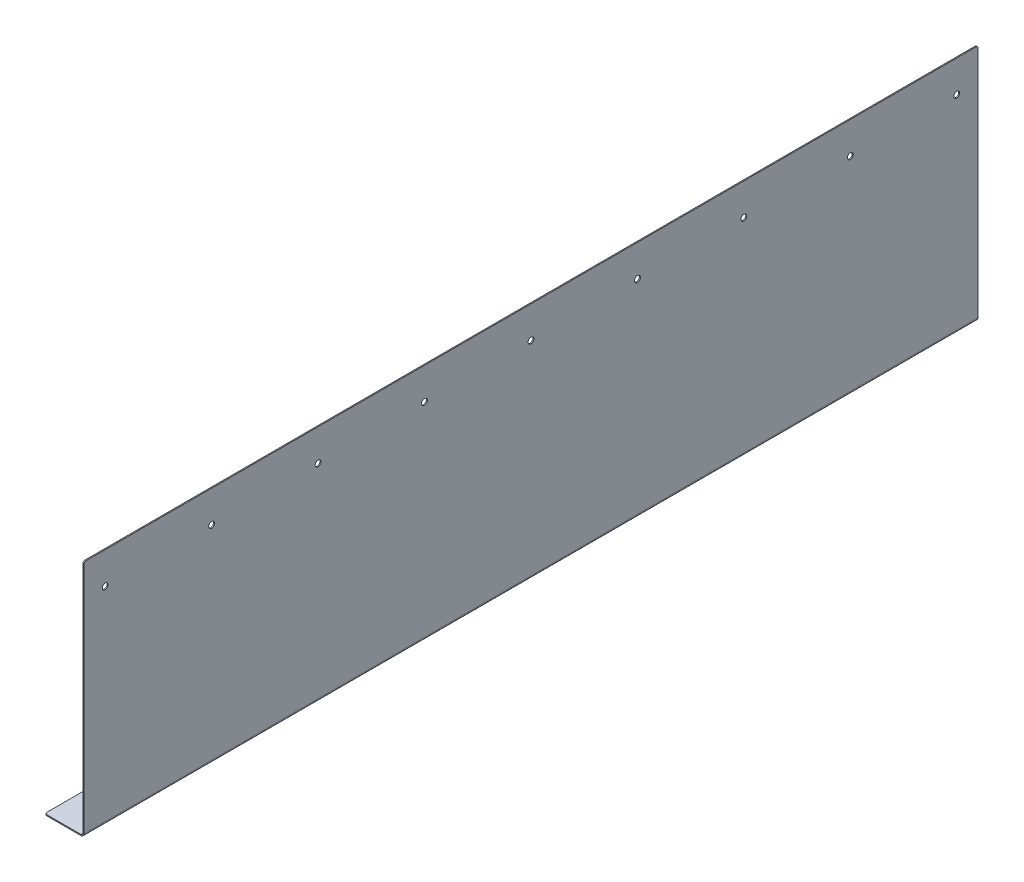
ISO-10303-21;
HEADER;
FILE_DESCRIPTION(('STEP AP214'),'2;1');
FILE_NAME('part.step','',(''),(''),'','','');
FILE_SCHEMA(('AUTOMOTIVE_DESIGN { 1 0 10303 214 1 1 1 1 }'));
ENDSEC;
DATA;
#1=APPLICATION_CONTEXT('core data for automotive mechanical design processes');
#2=APPLICATION_PROTOCOL_DEFINITION('international standard','automotive_design',2000,#1);
#3=PRODUCT_CONTEXT('',#1,'mechanical');
#4=PRODUCT('Part','Part','',(#3));
#5=PRODUCT_RELATED_PRODUCT_CATEGORY('part','',(#4));
#6=PRODUCT_DEFINITION_FORMATION('','',#4);
#7=PRODUCT_DEFINITION_CONTEXT('part definition',#1,'design');
#8=PRODUCT_DEFINITION('design','',#6,#7);
#9=PRODUCT_DEFINITION_SHAPE('','',#8);
#10=(LENGTH_UNIT() NAMED_UNIT(*) SI_UNIT(.MILLI.,.METRE.));
#11=(NAMED_UNIT(*) PLANE_ANGLE_UNIT() SI_UNIT($,.RADIAN.));
#12=(NAMED_UNIT(*) SI_UNIT($,.STERADIAN.) SOLID_ANGLE_UNIT());
#13=UNCERTAINTY_MEASURE_WITH_UNIT(LENGTH_MEASURE(1.E-05),#10,'distance_accuracy_value','');
#14=(GEOMETRIC_REPRESENTATION_CONTEXT(3) GLOBAL_UNCERTAINTY_ASSIGNED_CONTEXT((#13)) GLOBAL_UNIT_ASSIGNED_CONTEXT((#10,
#11,#12)) REPRESENTATION_CONTEXT('',''));
#15=CARTESIAN_POINT('',(0.,0.,0.));
#16=DIRECTION('',(0.,0.,1.));
#17=DIRECTION('',(1.,0.,0.));
#18=AXIS2_PLACEMENT_3D('',#15,#16,#17);
#19=CARTESIAN_POINT('',(1.,0.,421.5));
#20=DIRECTION('',(-1.,0.,0.));
#21=DIRECTION('',(0.,0.,1.));
#22=AXIS2_PLACEMENT_3D('',#19,#20,#21);
#23=PLANE('',#22);
#24=CARTESIAN_POINT('',(1.,195.,-301.125));
#25=DIRECTION('',(-1.,0.,0.));
#26=DIRECTION('',(0.,0.,1.));
#27=AXIS2_PLACEMENT_3D('',#24,#25,#26);
#28=CIRCLE('',#27,2.75);
#29=CARTESIAN_POINT('',(1.,195.,-298.375));
#30=VERTEX_POINT('',#29);
#31=EDGE_CURVE('E378',#30,#30,#28,.T.);
#32=ORIENTED_EDGE('',*,*,#31,.T.);
#33=EDGE_LOOP('',(#32));
#34=FACE_BOUND('',#33,.T.);
#35=CARTESIAN_POINT('',(1.,195.,-200.75));
#36=DIRECTION('',(-1.,0.,0.));
#37=DIRECTION('',(0.,0.,1.));
#38=AXIS2_PLACEMENT_3D('',#35,#36,#37);
#39=CIRCLE('',#38,2.75);
#40=CARTESIAN_POINT('',(1.,195.,-198.));
#41=VERTEX_POINT('',#40);
#42=EDGE_CURVE('E371',#41,#41,#39,.T.);
#43=ORIENTED_EDGE('',*,*,#42,.T.);
#44=EDGE_LOOP('',(#43));
#45=FACE_BOUND('',#44,.T.);
#46=CARTESIAN_POINT('',(1.,195.,-100.375));
#47=DIRECTION('',(-1.,0.,0.));
#48=DIRECTION('',(0.,0.,1.));
#49=AXIS2_PLACEMENT_3D('',#46,#47,#48);
#50=CIRCLE('',#49,2.75);
#51=CARTESIAN_POINT('',(1.,195.,-97.625));
#52=VERTEX_POINT('',#51);
#53=EDGE_CURVE('E362',#52,#52,#50,.T.);
#54=ORIENTED_EDGE('',*,*,#53,.T.);
#55=EDGE_LOOP('',(#54));
#56=FACE_BOUND('',#55,.T.);
#57=CARTESIAN_POINT('',(1.,195.,0.));
#58=DIRECTION('',(-1.,0.,0.));
#59=DIRECTION('',(0.,0.,1.));
#60=AXIS2_PLACEMENT_3D('',#57,#58,#59);
#61=CIRCLE('',#60,2.75);
#62=CARTESIAN_POINT('',(1.,195.,2.75));
#63=VERTEX_POINT('',#62);
#64=EDGE_CURVE('E353',#63,#63,#61,.T.);
#65=ORIENTED_EDGE('',*,*,#64,.T.);
#66=EDGE_LOOP('',(#65));
#67=FACE_BOUND('',#66,.T.);
#68=CARTESIAN_POINT('',(1.,195.,100.375));
#69=DIRECTION('',(-1.,0.,0.));
#70=DIRECTION('',(0.,0.,1.));
#71=AXIS2_PLACEMENT_3D('',#68,#69,#70);
#72=CIRCLE('',#71,2.75);
#73=CARTESIAN_POINT('',(1.,195.,103.125));
#74=VERTEX_POINT('',#73);
#75=EDGE_CURVE('E344',#74,#74,#72,.T.);
#76=ORIENTED_EDGE('',*,*,#75,.T.);
#77=EDGE_LOOP('',(#76));
#78=FACE_BOUND('',#77,.T.);
#79=CARTESIAN_POINT('',(1.,195.,200.75));
#80=DIRECTION('',(-1.,0.,0.));
#81=DIRECTION('',(0.,0.,1.));
#82=AXIS2_PLACEMENT_3D('',#79,#80,#81);
#83=CIRCLE('',#82,2.75);
#84=CARTESIAN_POINT('',(1.,195.,203.5));
#85=VERTEX_POINT('',#84);
#86=EDGE_CURVE('E335',#85,#85,#83,.T.);
#87=ORIENTED_EDGE('',*,*,#86,.T.);
#88=EDGE_LOOP('',(#87));
#89=FACE_BOUND('',#88,.T.);
#90=CARTESIAN_POINT('',(1.,195.,301.125));
#91=DIRECTION('',(-1.,0.,0.));
#92=DIRECTION('',(0.,0.,1.));
#93=AXIS2_PLACEMENT_3D('',#90,#91,#92);
#94=CIRCLE('',#93,2.75);
#95=CARTESIAN_POINT('',(1.,195.,303.875));
#96=VERTEX_POINT('',#95);
#97=EDGE_CURVE('E326',#96,#96,#94,.T.);
#98=ORIENTED_EDGE('',*,*,#97,.T.);
#99=EDGE_LOOP('',(#98));
#100=FACE_BOUND('',#99,.T.);
#101=CARTESIAN_POINT('',(1.,195.,401.5));
#102=DIRECTION('',(-1.,0.,0.));
#103=DIRECTION('',(0.,0.,1.));
#104=AXIS2_PLACEMENT_3D('',#101,#102,#103);
#105=CIRCLE('',#104,2.75);
#106=CARTESIAN_POINT('',(1.,195.,404.25));
#107=VERTEX_POINT('',#106);
#108=EDGE_CURVE('E316',#107,#107,#105,.T.);
#109=ORIENTED_EDGE('',*,*,#108,.T.);
#110=EDGE_LOOP('',(#109));
#111=FACE_BOUND('',#110,.T.);
#112=CARTESIAN_POINT('',(1.,195.,-401.5));
#113=DIRECTION('',(-1.,0.,0.));
#114=DIRECTION('',(0.,0.,1.));
#115=AXIS2_PLACEMENT_3D('',#112,#113,#114);
#116=CIRCLE('',#115,2.75);
#117=CARTESIAN_POINT('',(1.,195.,-398.75));
#118=VERTEX_POINT('',#117);
#119=EDGE_CURVE('E211',#118,#118,#116,.T.);
#120=ORIENTED_EDGE('',*,*,#119,.T.);
#121=EDGE_LOOP('',(#120));
#122=FACE_BOUND('',#121,.T.);
#123=DIRECTION('',(0.,0.,-1.));
#124=VECTOR('',#123,1.);
#125=CARTESIAN_POINT('',(1.,225.,421.5));
#126=LINE('',#125,#124);
#127=CARTESIAN_POINT('',(1.,225.,419.5));
#128=VERTEX_POINT('',#127);
#129=CARTESIAN_POINT('',(1.,225.,-419.5));
#130=VERTEX_POINT('',#129);
#131=EDGE_CURVE('E238',#128,#130,#126,.T.);
#132=ORIENTED_EDGE('',*,*,#131,.F.);
#133=CARTESIAN_POINT('',(1.,223.,419.5));
#134=DIRECTION('',(-1.,0.,0.));
#135=DIRECTION('',(0.,0.,1.));
#136=AXIS2_PLACEMENT_3D('',#133,#134,#135);
#137=CIRCLE('',#136,2.);
#138=CARTESIAN_POINT('',(1.,223.,421.5));
#139=VERTEX_POINT('',#138);
#140=EDGE_CURVE('E265',#128,#139,#137,.F.);
#141=ORIENTED_EDGE('',*,*,#140,.T.);
#142=DIRECTION('',(0.,1.,0.));
#143=VECTOR('',#142,1.);
#144=CARTESIAN_POINT('',(1.,0.,421.5));
#145=LINE('',#144,#143);
#146=CARTESIAN_POINT('',(1.,2.99999999999999,421.5));
#147=VERTEX_POINT('',#146);
#148=EDGE_CURVE('E228',#147,#139,#145,.T.);
#149=ORIENTED_EDGE('',*,*,#148,.F.);
#150=DIRECTION('',(0.,0.,1.));
#151=VECTOR('',#150,1.);
#152=CARTESIAN_POINT('',(1.,2.99999999999999,421.5));
#153=LINE('',#152,#151);
#154=CARTESIAN_POINT('',(1.,2.99999999999999,-421.5));
#155=VERTEX_POINT('',#154);
#156=EDGE_CURVE('E166',#147,#155,#153,.F.);
#157=ORIENTED_EDGE('',*,*,#156,.T.);
#158=DIRECTION('',(0.,1.,0.));
#159=VECTOR('',#158,1.);
#160=CARTESIAN_POINT('',(1.,0.,-421.5));
#161=LINE('',#160,#159);
#162=CARTESIAN_POINT('',(1.,223.,-421.5));
#163=VERTEX_POINT('',#162);
#164=EDGE_CURVE('E225',#155,#163,#161,.T.);
#165=ORIENTED_EDGE('',*,*,#164,.T.);
#166=CARTESIAN_POINT('',(1.,223.,-419.5));
#167=DIRECTION('',(-1.,0.,0.));
#168=DIRECTION('',(0.,0.,1.));
#169=AXIS2_PLACEMENT_3D('',#166,#167,#168);
#170=CIRCLE('',#169,2.);
#171=EDGE_CURVE('E263',#163,#130,#170,.F.);
#172=ORIENTED_EDGE('',*,*,#171,.T.);
#173=EDGE_LOOP('',(#132,#141,#149,#157,#165,#172));
#174=FACE_BOUND('',#173,.T.);
#175=ADVANCED_FACE('F64',(#34,#45,#56,#67,#78,#89,#100,#111,#122,#174),#23,.F.);
#176=CARTESIAN_POINT('',(0.,0.,421.5));
#177=DIRECTION('',(-1.,0.,0.));
#178=DIRECTION('',(0.,0.,1.));
#179=AXIS2_PLACEMENT_3D('',#176,#177,#178);
#180=PLANE('',#179);
#181=CARTESIAN_POINT('',(0.,195.,-301.125));
#182=DIRECTION('',(-1.,0.,0.));
#183=DIRECTION('',(0.,0.,1.));
#184=AXIS2_PLACEMENT_3D('',#181,#182,#183);
#185=CIRCLE('',#184,2.775);
#186=CARTESIAN_POINT('',(0.,195.,-298.35));
#187=VERTEX_POINT('',#186);
#188=EDGE_CURVE('E370',#187,#187,#185,.T.);
#189=ORIENTED_EDGE('',*,*,#188,.F.);
#190=EDGE_LOOP('',(#189));
#191=FACE_BOUND('',#190,.T.);
#192=CARTESIAN_POINT('',(0.,195.,-200.75));
#193=DIRECTION('',(-1.,0.,0.));
#194=DIRECTION('',(0.,0.,1.));
#195=AXIS2_PLACEMENT_3D('',#192,#193,#194);
#196=CIRCLE('',#195,2.775);
#197=CARTESIAN_POINT('',(0.,195.,-197.975));
#198=VERTEX_POINT('',#197);
#199=EDGE_CURVE('E361',#198,#198,#196,.T.);
#200=ORIENTED_EDGE('',*,*,#199,.F.);
#201=EDGE_LOOP('',(#200));
#202=FACE_BOUND('',#201,.T.);
#203=CARTESIAN_POINT('',(0.,195.,-100.375));
#204=DIRECTION('',(-1.,0.,0.));
#205=DIRECTION('',(0.,0.,1.));
#206=AXIS2_PLACEMENT_3D('',#203,#204,#205);
#207=CIRCLE('',#206,2.775);
#208=CARTESIAN_POINT('',(0.,195.,-97.6));
#209=VERTEX_POINT('',#208);
#210=EDGE_CURVE('E352',#209,#209,#207,.T.);
#211=ORIENTED_EDGE('',*,*,#210,.F.);
#212=EDGE_LOOP('',(#211));
#213=FACE_BOUND('',#212,.T.);
#214=CARTESIAN_POINT('',(0.,195.,0.));
#215=DIRECTION('',(-1.,0.,0.));
#216=DIRECTION('',(0.,0.,1.));
#217=AXIS2_PLACEMENT_3D('',#214,#215,#216);
#218=CIRCLE('',#217,2.775);
#219=CARTESIAN_POINT('',(0.,195.,2.775));
#220=VERTEX_POINT('',#219);
#221=EDGE_CURVE('E343',#220,#220,#218,.T.);
#222=ORIENTED_EDGE('',*,*,#221,.F.);
#223=EDGE_LOOP('',(#222));
#224=FACE_BOUND('',#223,.T.);
#225=CARTESIAN_POINT('',(0.,195.,100.375));
#226=DIRECTION('',(-1.,0.,0.));
#227=DIRECTION('',(0.,0.,1.));
#228=AXIS2_PLACEMENT_3D('',#225,#226,#227);
#229=CIRCLE('',#228,2.775);
#230=CARTESIAN_POINT('',(0.,195.,103.15));
#231=VERTEX_POINT('',#230);
#232=EDGE_CURVE('E334',#231,#231,#229,.T.);
#233=ORIENTED_EDGE('',*,*,#232,.F.);
#234=EDGE_LOOP('',(#233));
#235=FACE_BOUND('',#234,.T.);
#236=CARTESIAN_POINT('',(0.,195.,200.75));
#237=DIRECTION('',(-1.,0.,0.));
#238=DIRECTION('',(0.,0.,1.));
#239=AXIS2_PLACEMENT_3D('',#236,#237,#238);
#240=CIRCLE('',#239,2.775);
#241=CARTESIAN_POINT('',(0.,195.,203.525));
#242=VERTEX_POINT('',#241);
#243=EDGE_CURVE('E325',#242,#242,#240,.T.);
#244=ORIENTED_EDGE('',*,*,#243,.F.);
#245=EDGE_LOOP('',(#244));
#246=FACE_BOUND('',#245,.T.);
#247=CARTESIAN_POINT('',(0.,195.,301.125));
#248=DIRECTION('',(-1.,0.,0.));
#249=DIRECTION('',(0.,0.,1.));
#250=AXIS2_PLACEMENT_3D('',#247,#248,#249);
#251=CIRCLE('',#250,2.775);
#252=CARTESIAN_POINT('',(0.,195.,303.9));
#253=VERTEX_POINT('',#252);
#254=EDGE_CURVE('E315',#253,#253,#251,.T.);
#255=ORIENTED_EDGE('',*,*,#254,.F.);
#256=EDGE_LOOP('',(#255));
#257=FACE_BOUND('',#256,.T.);
#258=CARTESIAN_POINT('',(0.,195.,401.5));
#259=DIRECTION('',(-1.,0.,0.));
#260=DIRECTION('',(0.,0.,1.));
#261=AXIS2_PLACEMENT_3D('',#258,#259,#260);
#262=CIRCLE('',#261,2.775);
#263=CARTESIAN_POINT('',(0.,195.,404.275));
#264=VERTEX_POINT('',#263);
#265=EDGE_CURVE('E319',#264,#264,#262,.T.);
#266=ORIENTED_EDGE('',*,*,#265,.F.);
#267=EDGE_LOOP('',(#266));
#268=FACE_BOUND('',#267,.T.);
#269=CARTESIAN_POINT('',(0.,195.,-401.5));
#270=DIRECTION('',(-1.,0.,0.));
#271=DIRECTION('',(0.,0.,1.));
#272=AXIS2_PLACEMENT_3D('',#269,#270,#271);
#273=CIRCLE('',#272,2.775);
#274=CARTESIAN_POINT('',(0.,195.,-398.725));
#275=VERTEX_POINT('',#274);
#276=EDGE_CURVE('E308',#275,#275,#273,.T.);
#277=ORIENTED_EDGE('',*,*,#276,.F.);
#278=EDGE_LOOP('',(#277));
#279=FACE_BOUND('',#278,.T.);
#280=DIRECTION('',(0.,1.,0.));
#281=VECTOR('',#280,1.);
#282=CARTESIAN_POINT('',(0.,0.,421.5));
#283=LINE('',#282,#281);
#284=CARTESIAN_POINT('',(0.,2.99999999999999,421.5));
#285=VERTEX_POINT('',#284);
#286=CARTESIAN_POINT('',(0.,223.,421.5));
#287=VERTEX_POINT('',#286);
#288=EDGE_CURVE('E230',#285,#287,#283,.T.);
#289=ORIENTED_EDGE('',*,*,#288,.T.);
#290=CARTESIAN_POINT('',(0.,223.,419.5));
#291=DIRECTION('',(-1.,0.,0.));
#292=DIRECTION('',(0.,0.,1.));
#293=AXIS2_PLACEMENT_3D('',#290,#291,#292);
#294=CIRCLE('',#293,2.);
#295=CARTESIAN_POINT('',(0.,225.,419.5));
#296=VERTEX_POINT('',#295);
#297=EDGE_CURVE('E72',#287,#296,#294,.T.);
#298=ORIENTED_EDGE('',*,*,#297,.T.);
#299=DIRECTION('',(0.,0.,-1.));
#300=VECTOR('',#299,1.);
#301=CARTESIAN_POINT('',(0.,225.,421.5));
#302=LINE('',#301,#300);
#303=CARTESIAN_POINT('',(0.,225.,-419.5));
#304=VERTEX_POINT('',#303);
#305=EDGE_CURVE('E233',#296,#304,#302,.T.);
#306=ORIENTED_EDGE('',*,*,#305,.T.);
#307=CARTESIAN_POINT('',(0.,223.,-419.5));
#308=DIRECTION('',(-1.,0.,0.));
#309=DIRECTION('',(0.,0.,1.));
#310=AXIS2_PLACEMENT_3D('',#307,#308,#309);
#311=CIRCLE('',#310,2.);
#312=CARTESIAN_POINT('',(0.,223.,-421.5));
#313=VERTEX_POINT('',#312);
#314=EDGE_CURVE('E79',#304,#313,#311,.T.);
#315=ORIENTED_EDGE('',*,*,#314,.T.);
#316=DIRECTION('',(0.,1.,0.));
#317=VECTOR('',#316,1.);
#318=CARTESIAN_POINT('',(0.,0.,-421.5));
#319=LINE('',#318,#317);
#320=CARTESIAN_POINT('',(0.,2.99999999999999,-421.5));
#321=VERTEX_POINT('',#320);
#322=EDGE_CURVE('E231',#321,#313,#319,.T.);
#323=ORIENTED_EDGE('',*,*,#322,.F.);
#324=DIRECTION('',(0.,0.,1.));
#325=VECTOR('',#324,1.);
#326=CARTESIAN_POINT('',(0.,2.99999999999999,421.5));
#327=LINE('',#326,#325);
#328=EDGE_CURVE('E218',#285,#321,#327,.F.);
#329=ORIENTED_EDGE('',*,*,#328,.F.);
#330=EDGE_LOOP('',(#289,#298,#306,#315,#323,#329));
#331=FACE_BOUND('',#330,.T.);
#332=ADVANCED_FACE('F270',(#191,#202,#213,#224,#235,#246,#257,#268,#279,#331),#180,.T.);
#333=CARTESIAN_POINT('',(0.,0.,421.5));
#334=DIRECTION('',(0.,0.,-1.));
#335=DIRECTION('',(-1.,0.,0.));
#336=AXIS2_PLACEMENT_3D('',#333,#334,#335);
#337=PLANE('',#336);
#338=ORIENTED_EDGE('',*,*,#148,.T.);
#339=DIRECTION('',(1.,0.,0.));
#340=VECTOR('',#339,1.);
#341=CARTESIAN_POINT('',(0.,223.,421.5));
#342=LINE('',#341,#340);
#343=EDGE_CURVE('E87',#139,#287,#342,.F.);
#344=ORIENTED_EDGE('',*,*,#343,.T.);
#345=ORIENTED_EDGE('',*,*,#288,.F.);
#346=DIRECTION('',(1.,0.,0.));
#347=VECTOR('',#346,1.);
#348=CARTESIAN_POINT('',(0.,2.99999999999999,421.5));
#349=LINE('',#348,#347);
#350=EDGE_CURVE('E214',#285,#147,#349,.T.);
#351=ORIENTED_EDGE('',*,*,#350,.T.);
#352=EDGE_LOOP('',(#338,#344,#345,#351));
#353=FACE_BOUND('',#352,.T.);
#354=ADVANCED_FACE('F279',(#353),#337,.F.);
#355=CARTESIAN_POINT('',(0.,225.,421.5));
#356=DIRECTION('',(0.,1.,0.));
#357=DIRECTION('',(0.,0.,1.));
#358=AXIS2_PLACEMENT_3D('',#355,#356,#357);
#359=PLANE('',#358);
#360=ORIENTED_EDGE('',*,*,#305,.F.);
#361=DIRECTION('',(1.,0.,0.));
#362=VECTOR('',#361,1.);
#363=CARTESIAN_POINT('',(1.,225.,419.5));
#364=LINE('',#363,#362);
#365=EDGE_CURVE('E260',#296,#128,#364,.T.);
#366=ORIENTED_EDGE('',*,*,#365,.T.);
#367=ORIENTED_EDGE('',*,*,#131,.T.);
#368=DIRECTION('',(1.,0.,0.));
#369=VECTOR('',#368,1.);
#370=CARTESIAN_POINT('',(0.,225.,-419.5));
#371=LINE('',#370,#369);
#372=EDGE_CURVE('E258',#130,#304,#371,.F.);
#373=ORIENTED_EDGE('',*,*,#372,.T.);
#374=EDGE_LOOP('',(#360,#366,#367,#373));
#375=FACE_BOUND('',#374,.T.);
#376=ADVANCED_FACE('F274',(#375),#359,.T.);
#377=CARTESIAN_POINT('',(0.,0.,-421.5));
#378=DIRECTION('',(0.,0.,-1.));
#379=DIRECTION('',(-1.,0.,0.));
#380=AXIS2_PLACEMENT_3D('',#377,#378,#379);
#381=PLANE('',#380);
#382=ORIENTED_EDGE('',*,*,#322,.T.);
#383=DIRECTION('',(1.,0.,0.));
#384=VECTOR('',#383,1.);
#385=CARTESIAN_POINT('',(0.,223.,-421.5));
#386=LINE('',#385,#384);
#387=EDGE_CURVE('E14',#313,#163,#386,.T.);
#388=ORIENTED_EDGE('',*,*,#387,.T.);
#389=ORIENTED_EDGE('',*,*,#164,.F.);
#390=DIRECTION('',(1.,0.,0.));
#391=VECTOR('',#390,1.);
#392=CARTESIAN_POINT('',(0.,2.99999999999999,-421.5));
#393=LINE('',#392,#391);
#394=EDGE_CURVE('E222',#321,#155,#393,.T.);
#395=ORIENTED_EDGE('',*,*,#394,.F.);
#396=EDGE_LOOP('',(#382,#388,#389,#395));
#397=FACE_BOUND('',#396,.T.);
#398=ADVANCED_FACE('F441',(#397),#381,.T.);
#399=CARTESIAN_POINT('',(-2.,2.99999999999999,-421.5));
#400=DIRECTION('',(0.,0.,-1.));
#401=DIRECTION('',(-1.,0.,0.));
#402=AXIS2_PLACEMENT_3D('',#399,#400,#401);
#403=PLANE('',#402);
#404=DIRECTION('',(0.,1.,0.));
#405=VECTOR('',#404,1.);
#406=CARTESIAN_POINT('',(-1.99999999999999,0.,-421.5));
#407=LINE('',#406,#405);
#408=CARTESIAN_POINT('',(-1.99999999999999,0.999999999999993,-421.5));
#409=VERTEX_POINT('',#408);
#410=CARTESIAN_POINT('',(-1.99999999999999,0.,-421.5));
#411=VERTEX_POINT('',#410);
#412=EDGE_CURVE('E208',#409,#411,#407,.F.);
#413=ORIENTED_EDGE('',*,*,#412,.F.);
#414=CARTESIAN_POINT('',(-2.,2.99999999999999,-421.5));
#415=DIRECTION('',(0.,0.,1.));
#416=DIRECTION('',(1.,0.,0.));
#417=AXIS2_PLACEMENT_3D('',#414,#415,#416);
#418=CIRCLE('',#417,2.);
#419=EDGE_CURVE('E169',#321,#409,#418,.F.);
#420=ORIENTED_EDGE('',*,*,#419,.F.);
#421=ORIENTED_EDGE('',*,*,#394,.T.);
#422=CARTESIAN_POINT('',(-2.,2.99999999999999,-421.5));
#423=DIRECTION('',(0.,0.,1.));
#424=DIRECTION('',(1.,0.,0.));
#425=AXIS2_PLACEMENT_3D('',#422,#423,#424);
#426=CIRCLE('',#425,3.);
#427=EDGE_CURVE('E213',#155,#411,#426,.F.);
#428=ORIENTED_EDGE('',*,*,#427,.T.);
#429=EDGE_LOOP('',(#413,#420,#421,#428));
#430=FACE_BOUND('',#429,.T.);
#431=ADVANCED_FACE('F443',(#430),#403,.T.);
#432=CARTESIAN_POINT('',(-2.,2.99999999999999,421.5));
#433=DIRECTION('',(0.,0.,-1.));
#434=DIRECTION('',(-1.,0.,0.));
#435=AXIS2_PLACEMENT_3D('',#432,#433,#434);
#436=PLANE('',#435);
#437=CARTESIAN_POINT('',(-2.,2.99999999999999,421.5));
#438=DIRECTION('',(0.,0.,1.));
#439=DIRECTION('',(1.,0.,0.));
#440=AXIS2_PLACEMENT_3D('',#437,#438,#439);
#441=CIRCLE('',#440,2.);
#442=CARTESIAN_POINT('',(-1.99999999999999,0.999999999999993,421.5));
#443=VERTEX_POINT('',#442);
#444=EDGE_CURVE('E176',#443,#285,#441,.T.);
#445=ORIENTED_EDGE('',*,*,#444,.F.);
#446=DIRECTION('',(0.,1.,0.));
#447=VECTOR('',#446,1.);
#448=CARTESIAN_POINT('',(-1.99999999999999,0.999999999999993,421.5));
#449=LINE('',#448,#447);
#450=CARTESIAN_POINT('',(-1.99999999999999,0.,421.5));
#451=VERTEX_POINT('',#450);
#452=EDGE_CURVE('E173',#443,#451,#449,.F.);
#453=ORIENTED_EDGE('',*,*,#452,.T.);
#454=CARTESIAN_POINT('',(-2.,2.99999999999999,421.5));
#455=DIRECTION('',(0.,0.,1.));
#456=DIRECTION('',(1.,0.,0.));
#457=AXIS2_PLACEMENT_3D('',#454,#455,#456);
#458=CIRCLE('',#457,3.);
#459=EDGE_CURVE('E158',#451,#147,#458,.T.);
#460=ORIENTED_EDGE('',*,*,#459,.T.);
#461=ORIENTED_EDGE('',*,*,#350,.F.);
#462=EDGE_LOOP('',(#445,#453,#460,#461));
#463=FACE_BOUND('',#462,.T.);
#464=ADVANCED_FACE('F174',(#463),#436,.F.);
#465=CARTESIAN_POINT('',(-2.,2.99999999999999,421.5));
#466=DIRECTION('',(0.,0.,1.));
#467=DIRECTION('',(0.,-1.,0.));
#468=AXIS2_PLACEMENT_3D('',#465,#466,#467);
#469=CYLINDRICAL_SURFACE('',#468,3.);
#470=ORIENTED_EDGE('',*,*,#156,.F.);
#471=ORIENTED_EDGE('',*,*,#459,.F.);
#472=DIRECTION('',(0.,0.,1.));
#473=VECTOR('',#472,1.);
#474=CARTESIAN_POINT('',(-1.99999999999999,0.,-421.5));
#475=LINE('',#474,#473);
#476=EDGE_CURVE('E163',#451,#411,#475,.F.);
#477=ORIENTED_EDGE('',*,*,#476,.T.);
#478=ORIENTED_EDGE('',*,*,#427,.F.);
#479=EDGE_LOOP('',(#470,#471,#477,#478));
#480=FACE_BOUND('',#479,.T.);
#481=ADVANCED_FACE('F160',(#480),#469,.T.);
#482=CARTESIAN_POINT('',(-2.,2.99999999999999,421.5));
#483=DIRECTION('',(0.,0.,1.));
#484=DIRECTION('',(0.,-1.,0.));
#485=AXIS2_PLACEMENT_3D('',#482,#483,#484);
#486=CYLINDRICAL_SURFACE('',#485,2.);
#487=ORIENTED_EDGE('',*,*,#328,.T.);
#488=ORIENTED_EDGE('',*,*,#419,.T.);
#489=DIRECTION('',(0.,0.,1.));
#490=VECTOR('',#489,1.);
#491=CARTESIAN_POINT('',(-1.99999999999999,0.999999999999993,-421.5));
#492=LINE('',#491,#490);
#493=EDGE_CURVE('E181',#409,#443,#492,.T.);
#494=ORIENTED_EDGE('',*,*,#493,.T.);
#495=ORIENTED_EDGE('',*,*,#444,.T.);
#496=EDGE_LOOP('',(#487,#488,#494,#495));
#497=FACE_BOUND('',#496,.T.);
#498=ADVANCED_FACE('F281',(#497),#486,.F.);
#499=CARTESIAN_POINT('',(-36.,-1.25767452008319E-13,421.5));
#500=DIRECTION('',(0.,0.,-1.));
#501=DIRECTION('',(-1.,0.,0.));
#502=AXIS2_PLACEMENT_3D('',#499,#500,#501);
#503=PLANE('',#502);
#504=DIRECTION('',(1.,0.,0.));
#505=VECTOR('',#504,1.);
#506=CARTESIAN_POINT('',(-36.,0.999999999999874,421.5));
#507=LINE('',#506,#505);
#508=CARTESIAN_POINT('',(-34.,0.999999999999881,421.5));
#509=VERTEX_POINT('',#508);
#510=EDGE_CURVE('E190',#443,#509,#507,.F.);
#511=ORIENTED_EDGE('',*,*,#510,.T.);
#512=DIRECTION('',(0.,1.,0.));
#513=VECTOR('',#512,1.);
#514=CARTESIAN_POINT('',(-34.,-1.18784489330632E-13,421.5));
#515=LINE('',#514,#513);
#516=CARTESIAN_POINT('',(-34.,-1.18710365520667E-13,421.5));
#517=VERTEX_POINT('',#516);
#518=EDGE_CURVE('E194',#509,#517,#515,.F.);
#519=ORIENTED_EDGE('',*,*,#518,.T.);
#520=DIRECTION('',(-1.,0.,0.));
#521=VECTOR('',#520,1.);
#522=CARTESIAN_POINT('',(-6.464515809938E-13,0.,421.5));
#523=LINE('',#522,#521);
#524=EDGE_CURVE('E186',#451,#517,#523,.T.);
#525=ORIENTED_EDGE('',*,*,#524,.F.);
#526=ORIENTED_EDGE('',*,*,#452,.F.);
#527=EDGE_LOOP('',(#511,#519,#525,#526));
#528=FACE_BOUND('',#527,.T.);
#529=ADVANCED_FACE('F192',(#528),#503,.F.);
#530=CARTESIAN_POINT('',(0.,0.,-421.5));
#531=DIRECTION('',(0.,0.,1.));
#532=DIRECTION('',(1.,0.,0.));
#533=AXIS2_PLACEMENT_3D('',#530,#531,#532);
#534=PLANE('',#533);
#535=DIRECTION('',(1.,0.,0.));
#536=VECTOR('',#535,1.);
#537=CARTESIAN_POINT('',(0.,0.,-421.5));
#538=LINE('',#537,#536);
#539=CARTESIAN_POINT('',(-34.,-1.18710365520667E-13,-421.5));
#540=VERTEX_POINT('',#539);
#541=EDGE_CURVE('E189',#540,#411,#538,.T.);
#542=ORIENTED_EDGE('',*,*,#541,.F.);
#543=DIRECTION('',(0.,1.,0.));
#544=VECTOR('',#543,1.);
#545=CARTESIAN_POINT('',(-34.,-1.18710365520667E-13,-421.5));
#546=LINE('',#545,#544);
#547=CARTESIAN_POINT('',(-34.,0.999999999999881,-421.5));
#548=VERTEX_POINT('',#547);
#549=EDGE_CURVE('E255',#540,#548,#546,.T.);
#550=ORIENTED_EDGE('',*,*,#549,.T.);
#551=DIRECTION('',(-1.,0.,0.));
#552=VECTOR('',#551,1.);
#553=CARTESIAN_POINT('',(0.,1.,-421.5));
#554=LINE('',#553,#552);
#555=EDGE_CURVE('E196',#548,#409,#554,.F.);
#556=ORIENTED_EDGE('',*,*,#555,.T.);
#557=ORIENTED_EDGE('',*,*,#412,.T.);
#558=EDGE_LOOP('',(#542,#550,#556,#557));
#559=FACE_BOUND('',#558,.T.);
#560=ADVANCED_FACE('F300',(#559),#534,.F.);
#561=CARTESIAN_POINT('',(0.,0.,0.));
#562=DIRECTION('',(0.,1.,0.));
#563=DIRECTION('',(-1.,0.,0.));
#564=AXIS2_PLACEMENT_3D('',#561,#562,#563);
#565=PLANE('',#564);
#566=ORIENTED_EDGE('',*,*,#524,.T.);
#567=CARTESIAN_POINT('',(-34.,-1.18710365520667E-13,419.5));
#568=DIRECTION('',(0.,1.,0.));
#569=DIRECTION('',(-1.,0.,0.));
#570=AXIS2_PLACEMENT_3D('',#567,#568,#569);
#571=CIRCLE('',#570,2.);
#572=CARTESIAN_POINT('',(-36.,-1.25693328198353E-13,419.5));
#573=VERTEX_POINT('',#572);
#574=EDGE_CURVE('E253',#517,#573,#571,.F.);
#575=ORIENTED_EDGE('',*,*,#574,.T.);
#576=DIRECTION('',(0.,0.,-1.));
#577=VECTOR('',#576,1.);
#578=CARTESIAN_POINT('',(-36.,-1.25693328198353E-13,0.));
#579=LINE('',#578,#577);
#580=CARTESIAN_POINT('',(-36.,-1.25693328198353E-13,-419.5));
#581=VERTEX_POINT('',#580);
#582=EDGE_CURVE('E195',#573,#581,#579,.T.);
#583=ORIENTED_EDGE('',*,*,#582,.T.);
#584=CARTESIAN_POINT('',(-34.,-1.18710365520667E-13,-419.5));
#585=DIRECTION('',(0.,1.,0.));
#586=DIRECTION('',(-1.,0.,0.));
#587=AXIS2_PLACEMENT_3D('',#584,#585,#586);
#588=CIRCLE('',#587,2.);
#589=EDGE_CURVE('E251',#581,#540,#588,.F.);
#590=ORIENTED_EDGE('',*,*,#589,.T.);
#591=ORIENTED_EDGE('',*,*,#541,.T.);
#592=ORIENTED_EDGE('',*,*,#476,.F.);
#593=EDGE_LOOP('',(#566,#575,#583,#590,#591,#592));
#594=FACE_BOUND('',#593,.T.);
#595=ADVANCED_FACE('F185',(#594),#565,.F.);
#596=CARTESIAN_POINT('',(0.,1.,0.));
#597=DIRECTION('',(0.,1.,0.));
#598=DIRECTION('',(-1.,0.,0.));
#599=AXIS2_PLACEMENT_3D('',#596,#597,#598);
#600=PLANE('',#599);
#601=DIRECTION('',(0.,0.,1.));
#602=VECTOR('',#601,1.);
#603=CARTESIAN_POINT('',(-36.,0.999999999999874,-421.5));
#604=LINE('',#603,#602);
#605=CARTESIAN_POINT('',(-36.,0.999999999999874,419.5));
#606=VERTEX_POINT('',#605);
#607=CARTESIAN_POINT('',(-36.,0.999999999999874,-419.5));
#608=VERTEX_POINT('',#607);
#609=EDGE_CURVE('E200',#606,#608,#604,.F.);
#610=ORIENTED_EDGE('',*,*,#609,.F.);
#611=CARTESIAN_POINT('',(-34.,0.999999999999881,419.5));
#612=DIRECTION('',(0.,1.,0.));
#613=DIRECTION('',(-1.,0.,0.));
#614=AXIS2_PLACEMENT_3D('',#611,#612,#613);
#615=CIRCLE('',#614,2.);
#616=EDGE_CURVE('E248',#606,#509,#615,.T.);
#617=ORIENTED_EDGE('',*,*,#616,.T.);
#618=ORIENTED_EDGE('',*,*,#510,.F.);
#619=ORIENTED_EDGE('',*,*,#493,.F.);
#620=ORIENTED_EDGE('',*,*,#555,.F.);
#621=CARTESIAN_POINT('',(-34.,0.999999999999881,-419.5));
#622=DIRECTION('',(0.,1.,0.));
#623=DIRECTION('',(-1.,0.,0.));
#624=AXIS2_PLACEMENT_3D('',#621,#622,#623);
#625=CIRCLE('',#624,2.);
#626=EDGE_CURVE('E246',#548,#608,#625,.T.);
#627=ORIENTED_EDGE('',*,*,#626,.T.);
#628=EDGE_LOOP('',(#610,#617,#618,#619,#620,#627));
#629=FACE_BOUND('',#628,.T.);
#630=ADVANCED_FACE('F287',(#629),#600,.T.);
#631=CARTESIAN_POINT('',(-36.,-1.25767452008319E-13,-421.5));
#632=DIRECTION('',(1.,0.,0.));
#633=DIRECTION('',(0.,1.,0.));
#634=AXIS2_PLACEMENT_3D('',#631,#632,#633);
#635=PLANE('',#634);
#636=ORIENTED_EDGE('',*,*,#582,.F.);
#637=DIRECTION('',(0.,1.,0.));
#638=VECTOR('',#637,1.);
#639=CARTESIAN_POINT('',(-36.,-1.25767452008319E-13,419.5));
#640=LINE('',#639,#638);
#641=EDGE_CURVE('E243',#573,#606,#640,.T.);
#642=ORIENTED_EDGE('',*,*,#641,.T.);
#643=ORIENTED_EDGE('',*,*,#609,.T.);
#644=DIRECTION('',(0.,1.,0.));
#645=VECTOR('',#644,1.);
#646=CARTESIAN_POINT('',(-36.,-1.25767452008319E-13,-419.5));
#647=LINE('',#646,#645);
#648=EDGE_CURVE('E241',#608,#581,#647,.F.);
#649=ORIENTED_EDGE('',*,*,#648,.T.);
#650=EDGE_LOOP('',(#636,#642,#643,#649));
#651=FACE_BOUND('',#650,.T.);
#652=ADVANCED_FACE('F294',(#651),#635,.F.);
#653=CARTESIAN_POINT('',(0.,195.,-401.5));
#654=DIRECTION('',(-1.,0.,0.));
#655=DIRECTION('',(0.,0.,1.));
#656=AXIS2_PLACEMENT_3D('',#653,#654,#655);
#657=CYLINDRICAL_SURFACE('',#656,2.75);
#658=ORIENTED_EDGE('',*,*,#119,.F.);
#659=EDGE_LOOP('',(#658));
#660=FACE_BOUND('',#659,.T.);
#661=CARTESIAN_POINT('',(0.0250000000000025,195.,-401.5));
#662=DIRECTION('',(-1.,0.,0.));
#663=DIRECTION('',(0.,0.,1.));
#664=AXIS2_PLACEMENT_3D('',#661,#662,#663);
#665=CIRCLE('',#664,2.75);
#666=CARTESIAN_POINT('',(0.0250000000000025,195.,-398.75));
#667=VERTEX_POINT('',#666);
#668=EDGE_CURVE('E305',#667,#667,#665,.T.);
#669=ORIENTED_EDGE('',*,*,#668,.T.);
#670=EDGE_LOOP('',(#669));
#671=FACE_BOUND('',#670,.T.);
#672=ADVANCED_FACE('F408',(#660,#671),#657,.F.);
#673=CARTESIAN_POINT('',(0.,195.,-401.5));
#674=DIRECTION('',(-1.,0.,0.));
#675=DIRECTION('',(0.,0.,1.));
#676=AXIS2_PLACEMENT_3D('',#673,#674,#675);
#677=CONICAL_SURFACE('',#676,2.775,0.785398163397344);
#678=ORIENTED_EDGE('',*,*,#668,.F.);
#679=EDGE_LOOP('',(#678));
#680=FACE_BOUND('',#679,.T.);
#681=ORIENTED_EDGE('',*,*,#276,.T.);
#682=EDGE_LOOP('',(#681));
#683=FACE_BOUND('',#682,.T.);
#684=ADVANCED_FACE('F405',(#680,#683),#677,.F.);
#685=CARTESIAN_POINT('',(0.,195.,401.5));
#686=DIRECTION('',(-1.,0.,0.));
#687=DIRECTION('',(0.,0.,1.));
#688=AXIS2_PLACEMENT_3D('',#685,#686,#687);
#689=CYLINDRICAL_SURFACE('',#688,2.75);
#690=ORIENTED_EDGE('',*,*,#108,.F.);
#691=EDGE_LOOP('',(#690));
#692=FACE_BOUND('',#691,.T.);
#693=CARTESIAN_POINT('',(0.0250000000000025,195.,401.5));
#694=DIRECTION('',(-1.,0.,0.));
#695=DIRECTION('',(0.,0.,1.));
#696=AXIS2_PLACEMENT_3D('',#693,#694,#695);
#697=CIRCLE('',#696,2.75);
#698=CARTESIAN_POINT('',(0.0250000000000025,195.,404.25));
#699=VERTEX_POINT('',#698);
#700=EDGE_CURVE('E312',#699,#699,#697,.T.);
#701=ORIENTED_EDGE('',*,*,#700,.T.);
#702=EDGE_LOOP('',(#701));
#703=FACE_BOUND('',#702,.T.);
#704=ADVANCED_FACE('F407',(#692,#703),#689,.F.);
#705=CARTESIAN_POINT('',(0.,195.,401.5));
#706=DIRECTION('',(-1.,0.,0.));
#707=DIRECTION('',(0.,0.,1.));
#708=AXIS2_PLACEMENT_3D('',#705,#706,#707);
#709=CONICAL_SURFACE('',#708,2.775,0.785398163397344);
#710=ORIENTED_EDGE('',*,*,#700,.F.);
#711=EDGE_LOOP('',(#710));
#712=FACE_BOUND('',#711,.T.);
#713=ORIENTED_EDGE('',*,*,#265,.T.);
#714=EDGE_LOOP('',(#713));
#715=FACE_BOUND('',#714,.T.);
#716=ADVANCED_FACE('F415',(#712,#715),#709,.F.);
#717=CARTESIAN_POINT('',(0.,195.,301.125));
#718=DIRECTION('',(-1.,0.,0.));
#719=DIRECTION('',(0.,0.,1.));
#720=AXIS2_PLACEMENT_3D('',#717,#718,#719);
#721=CYLINDRICAL_SURFACE('',#720,2.75);
#722=ORIENTED_EDGE('',*,*,#97,.F.);
#723=EDGE_LOOP('',(#722));
#724=FACE_BOUND('',#723,.T.);
#725=CARTESIAN_POINT('',(0.0250000000000025,195.,301.125));
#726=DIRECTION('',(-1.,0.,0.));
#727=DIRECTION('',(0.,0.,1.));
#728=AXIS2_PLACEMENT_3D('',#725,#726,#727);
#729=CIRCLE('',#728,2.75);
#730=CARTESIAN_POINT('',(0.0250000000000025,195.,303.875));
#731=VERTEX_POINT('',#730);
#732=EDGE_CURVE('E322',#731,#731,#729,.T.);
#733=ORIENTED_EDGE('',*,*,#732,.T.);
#734=EDGE_LOOP('',(#733));
#735=FACE_BOUND('',#734,.T.);
#736=ADVANCED_FACE('F554',(#724,#735),#721,.F.);
#737=CARTESIAN_POINT('',(0.,195.,301.125));
#738=DIRECTION('',(-1.,0.,0.));
#739=DIRECTION('',(0.,0.,1.));
#740=AXIS2_PLACEMENT_3D('',#737,#738,#739);
#741=CONICAL_SURFACE('',#740,2.775,0.785398163397344);
#742=ORIENTED_EDGE('',*,*,#732,.F.);
#743=EDGE_LOOP('',(#742));
#744=FACE_BOUND('',#743,.T.);
#745=ORIENTED_EDGE('',*,*,#254,.T.);
#746=EDGE_LOOP('',(#745));
#747=FACE_BOUND('',#746,.T.);
#748=ADVANCED_FACE('F568',(#744,#747),#741,.F.);
#749=CARTESIAN_POINT('',(0.,195.,200.75));
#750=DIRECTION('',(-1.,0.,0.));
#751=DIRECTION('',(0.,0.,1.));
#752=AXIS2_PLACEMENT_3D('',#749,#750,#751);
#753=CYLINDRICAL_SURFACE('',#752,2.75);
#754=ORIENTED_EDGE('',*,*,#86,.F.);
#755=EDGE_LOOP('',(#754));
#756=FACE_BOUND('',#755,.T.);
#757=CARTESIAN_POINT('',(0.0250000000000025,195.,200.75));
#758=DIRECTION('',(-1.,0.,0.));
#759=DIRECTION('',(0.,0.,1.));
#760=AXIS2_PLACEMENT_3D('',#757,#758,#759);
#761=CIRCLE('',#760,2.75);
#762=CARTESIAN_POINT('',(0.0250000000000025,195.,203.5));
#763=VERTEX_POINT('',#762);
#764=EDGE_CURVE('E331',#763,#763,#761,.T.);
#765=ORIENTED_EDGE('',*,*,#764,.T.);
#766=EDGE_LOOP('',(#765));
#767=FACE_BOUND('',#766,.T.);
#768=ADVANCED_FACE('F573',(#756,#767),#753,.F.);
#769=CARTESIAN_POINT('',(0.,195.,200.75));
#770=DIRECTION('',(-1.,0.,0.));
#771=DIRECTION('',(0.,0.,1.));
#772=AXIS2_PLACEMENT_3D('',#769,#770,#771);
#773=CONICAL_SURFACE('',#772,2.775,0.785398163397344);
#774=ORIENTED_EDGE('',*,*,#764,.F.);
#775=EDGE_LOOP('',(#774));
#776=FACE_BOUND('',#775,.T.);
#777=ORIENTED_EDGE('',*,*,#243,.T.);
#778=EDGE_LOOP('',(#777));
#779=FACE_BOUND('',#778,.T.);
#780=ADVANCED_FACE('F588',(#776,#779),#773,.F.);
#781=CARTESIAN_POINT('',(0.,195.,100.375));
#782=DIRECTION('',(-1.,0.,0.));
#783=DIRECTION('',(0.,0.,1.));
#784=AXIS2_PLACEMENT_3D('',#781,#782,#783);
#785=CYLINDRICAL_SURFACE('',#784,2.75);
#786=ORIENTED_EDGE('',*,*,#75,.F.);
#787=EDGE_LOOP('',(#786));
#788=FACE_BOUND('',#787,.T.);
#789=CARTESIAN_POINT('',(0.0250000000000025,195.,100.375));
#790=DIRECTION('',(-1.,0.,0.));
#791=DIRECTION('',(0.,0.,1.));
#792=AXIS2_PLACEMENT_3D('',#789,#790,#791);
#793=CIRCLE('',#792,2.75);
#794=CARTESIAN_POINT('',(0.0250000000000025,195.,103.125));
#795=VERTEX_POINT('',#794);
#796=EDGE_CURVE('E340',#795,#795,#793,.T.);
#797=ORIENTED_EDGE('',*,*,#796,.T.);
#798=EDGE_LOOP('',(#797));
#799=FACE_BOUND('',#798,.T.);
#800=ADVANCED_FACE('F593',(#788,#799),#785,.F.);
#801=CARTESIAN_POINT('',(0.,195.,100.375));
#802=DIRECTION('',(-1.,0.,0.));
#803=DIRECTION('',(0.,0.,1.));
#804=AXIS2_PLACEMENT_3D('',#801,#802,#803);
#805=CONICAL_SURFACE('',#804,2.775,0.785398163397344);
#806=ORIENTED_EDGE('',*,*,#796,.F.);
#807=EDGE_LOOP('',(#806));
#808=FACE_BOUND('',#807,.T.);
#809=ORIENTED_EDGE('',*,*,#232,.T.);
#810=EDGE_LOOP('',(#809));
#811=FACE_BOUND('',#810,.T.);
#812=ADVANCED_FACE('F608',(#808,#811),#805,.F.);
#813=CARTESIAN_POINT('',(0.,195.,0.));
#814=DIRECTION('',(-1.,0.,0.));
#815=DIRECTION('',(0.,0.,1.));
#816=AXIS2_PLACEMENT_3D('',#813,#814,#815);
#817=CYLINDRICAL_SURFACE('',#816,2.75);
#818=ORIENTED_EDGE('',*,*,#64,.F.);
#819=EDGE_LOOP('',(#818));
#820=FACE_BOUND('',#819,.T.);
#821=CARTESIAN_POINT('',(0.0250000000000025,195.,0.));
#822=DIRECTION('',(-1.,0.,0.));
#823=DIRECTION('',(0.,0.,1.));
#824=AXIS2_PLACEMENT_3D('',#821,#822,#823);
#825=CIRCLE('',#824,2.75);
#826=CARTESIAN_POINT('',(0.0250000000000025,195.,2.75));
#827=VERTEX_POINT('',#826);
#828=EDGE_CURVE('E349',#827,#827,#825,.T.);
#829=ORIENTED_EDGE('',*,*,#828,.T.);
#830=EDGE_LOOP('',(#829));
#831=FACE_BOUND('',#830,.T.);
#832=ADVANCED_FACE('F613',(#820,#831),#817,.F.);
#833=CARTESIAN_POINT('',(0.,195.,0.));
#834=DIRECTION('',(-1.,0.,0.));
#835=DIRECTION('',(0.,0.,1.));
#836=AXIS2_PLACEMENT_3D('',#833,#834,#835);
#837=CONICAL_SURFACE('',#836,2.775,0.785398163397344);
#838=ORIENTED_EDGE('',*,*,#828,.F.);
#839=EDGE_LOOP('',(#838));
#840=FACE_BOUND('',#839,.T.);
#841=ORIENTED_EDGE('',*,*,#221,.T.);
#842=EDGE_LOOP('',(#841));
#843=FACE_BOUND('',#842,.T.);
#844=ADVANCED_FACE('F628',(#840,#843),#837,.F.);
#845=CARTESIAN_POINT('',(0.,195.,-100.375));
#846=DIRECTION('',(-1.,0.,0.));
#847=DIRECTION('',(0.,0.,1.));
#848=AXIS2_PLACEMENT_3D('',#845,#846,#847);
#849=CYLINDRICAL_SURFACE('',#848,2.75);
#850=ORIENTED_EDGE('',*,*,#53,.F.);
#851=EDGE_LOOP('',(#850));
#852=FACE_BOUND('',#851,.T.);
#853=CARTESIAN_POINT('',(0.0250000000000025,195.,-100.375));
#854=DIRECTION('',(-1.,0.,0.));
#855=DIRECTION('',(0.,0.,1.));
#856=AXIS2_PLACEMENT_3D('',#853,#854,#855);
#857=CIRCLE('',#856,2.75);
#858=CARTESIAN_POINT('',(0.0250000000000025,195.,-97.625));
#859=VERTEX_POINT('',#858);
#860=EDGE_CURVE('E358',#859,#859,#857,.T.);
#861=ORIENTED_EDGE('',*,*,#860,.T.);
#862=EDGE_LOOP('',(#861));
#863=FACE_BOUND('',#862,.T.);
#864=ADVANCED_FACE('F633',(#852,#863),#849,.F.);
#865=CARTESIAN_POINT('',(0.,195.,-100.375));
#866=DIRECTION('',(-1.,0.,0.));
#867=DIRECTION('',(0.,0.,1.));
#868=AXIS2_PLACEMENT_3D('',#865,#866,#867);
#869=CONICAL_SURFACE('',#868,2.775,0.785398163397344);
#870=ORIENTED_EDGE('',*,*,#860,.F.);
#871=EDGE_LOOP('',(#870));
#872=FACE_BOUND('',#871,.T.);
#873=ORIENTED_EDGE('',*,*,#210,.T.);
#874=EDGE_LOOP('',(#873));
#875=FACE_BOUND('',#874,.T.);
#876=ADVANCED_FACE('F648',(#872,#875),#869,.F.);
#877=CARTESIAN_POINT('',(0.,195.,-200.75));
#878=DIRECTION('',(-1.,0.,0.));
#879=DIRECTION('',(0.,0.,1.));
#880=AXIS2_PLACEMENT_3D('',#877,#878,#879);
#881=CYLINDRICAL_SURFACE('',#880,2.75);
#882=ORIENTED_EDGE('',*,*,#42,.F.);
#883=EDGE_LOOP('',(#882));
#884=FACE_BOUND('',#883,.T.);
#885=CARTESIAN_POINT('',(0.0250000000000025,195.,-200.75));
#886=DIRECTION('',(-1.,0.,0.));
#887=DIRECTION('',(0.,0.,1.));
#888=AXIS2_PLACEMENT_3D('',#885,#886,#887);
#889=CIRCLE('',#888,2.75);
#890=CARTESIAN_POINT('',(0.0250000000000025,195.,-198.));
#891=VERTEX_POINT('',#890);
#892=EDGE_CURVE('E367',#891,#891,#889,.T.);
#893=ORIENTED_EDGE('',*,*,#892,.T.);
#894=EDGE_LOOP('',(#893));
#895=FACE_BOUND('',#894,.T.);
#896=ADVANCED_FACE('F653',(#884,#895),#881,.F.);
#897=CARTESIAN_POINT('',(0.,195.,-200.75));
#898=DIRECTION('',(-1.,0.,0.));
#899=DIRECTION('',(0.,0.,1.));
#900=AXIS2_PLACEMENT_3D('',#897,#898,#899);
#901=CONICAL_SURFACE('',#900,2.775,0.785398163397344);
#902=ORIENTED_EDGE('',*,*,#892,.F.);
#903=EDGE_LOOP('',(#902));
#904=FACE_BOUND('',#903,.T.);
#905=ORIENTED_EDGE('',*,*,#199,.T.);
#906=EDGE_LOOP('',(#905));
#907=FACE_BOUND('',#906,.T.);
#908=ADVANCED_FACE('F668',(#904,#907),#901,.F.);
#909=CARTESIAN_POINT('',(0.,195.,-301.125));
#910=DIRECTION('',(-1.,0.,0.));
#911=DIRECTION('',(0.,0.,1.));
#912=AXIS2_PLACEMENT_3D('',#909,#910,#911);
#913=CYLINDRICAL_SURFACE('',#912,2.75);
#914=ORIENTED_EDGE('',*,*,#31,.F.);
#915=EDGE_LOOP('',(#914));
#916=FACE_BOUND('',#915,.T.);
#917=CARTESIAN_POINT('',(0.0250000000000025,195.,-301.125));
#918=DIRECTION('',(-1.,0.,0.));
#919=DIRECTION('',(0.,0.,1.));
#920=AXIS2_PLACEMENT_3D('',#917,#918,#919);
#921=CIRCLE('',#920,2.75);
#922=CARTESIAN_POINT('',(0.0250000000000025,195.,-298.375));
#923=VERTEX_POINT('',#922);
#924=EDGE_CURVE('E311',#923,#923,#921,.T.);
#925=ORIENTED_EDGE('',*,*,#924,.T.);
#926=EDGE_LOOP('',(#925));
#927=FACE_BOUND('',#926,.T.);
#928=ADVANCED_FACE('F673',(#916,#927),#913,.F.);
#929=CARTESIAN_POINT('',(0.,195.,-301.125));
#930=DIRECTION('',(-1.,0.,0.));
#931=DIRECTION('',(0.,0.,1.));
#932=AXIS2_PLACEMENT_3D('',#929,#930,#931);
#933=CONICAL_SURFACE('',#932,2.775,0.785398163397344);
#934=ORIENTED_EDGE('',*,*,#924,.F.);
#935=EDGE_LOOP('',(#934));
#936=FACE_BOUND('',#935,.T.);
#937=ORIENTED_EDGE('',*,*,#188,.T.);
#938=EDGE_LOOP('',(#937));
#939=FACE_BOUND('',#938,.T.);
#940=ADVANCED_FACE('F384',(#936,#939),#933,.F.);
#941=CARTESIAN_POINT('',(-34.,-1.18784489330632E-13,419.5));
#942=DIRECTION('',(0.,1.,0.));
#943=DIRECTION('',(-1.,0.,0.));
#944=AXIS2_PLACEMENT_3D('',#941,#942,#943);
#945=CYLINDRICAL_SURFACE('',#944,2.);
#946=ORIENTED_EDGE('',*,*,#574,.F.);
#947=ORIENTED_EDGE('',*,*,#518,.F.);
#948=ORIENTED_EDGE('',*,*,#616,.F.);
#949=ORIENTED_EDGE('',*,*,#641,.F.);
#950=EDGE_LOOP('',(#946,#947,#948,#949));
#951=FACE_BOUND('',#950,.T.);
#952=ADVANCED_FACE('F289',(#951),#945,.T.);
#953=CARTESIAN_POINT('',(-34.,-1.18710365520667E-13,-419.5));
#954=DIRECTION('',(0.,1.,0.));
#955=DIRECTION('',(-1.,0.,0.));
#956=AXIS2_PLACEMENT_3D('',#953,#954,#955);
#957=CYLINDRICAL_SURFACE('',#956,2.);
#958=ORIENTED_EDGE('',*,*,#589,.F.);
#959=ORIENTED_EDGE('',*,*,#648,.F.);
#960=ORIENTED_EDGE('',*,*,#626,.F.);
#961=ORIENTED_EDGE('',*,*,#549,.F.);
#962=EDGE_LOOP('',(#958,#959,#960,#961));
#963=FACE_BOUND('',#962,.T.);
#964=ADVANCED_FACE('F297',(#963),#957,.T.);
#965=CARTESIAN_POINT('',(0.,223.,419.5));
#966=DIRECTION('',(-1.,0.,0.));
#967=DIRECTION('',(0.,0.,1.));
#968=AXIS2_PLACEMENT_3D('',#965,#966,#967);
#969=CYLINDRICAL_SURFACE('',#968,2.);
#970=ORIENTED_EDGE('',*,*,#297,.F.);
#971=ORIENTED_EDGE('',*,*,#343,.F.);
#972=ORIENTED_EDGE('',*,*,#140,.F.);
#973=ORIENTED_EDGE('',*,*,#365,.F.);
#974=EDGE_LOOP('',(#970,#971,#972,#973));
#975=FACE_BOUND('',#974,.T.);
#976=ADVANCED_FACE('F277',(#975),#969,.T.);
#977=CARTESIAN_POINT('',(0.,223.,-419.5));
#978=DIRECTION('',(1.,0.,0.));
#979=DIRECTION('',(0.,0.,-1.));
#980=AXIS2_PLACEMENT_3D('',#977,#978,#979);
#981=CYLINDRICAL_SURFACE('',#980,2.);
#982=ORIENTED_EDGE('',*,*,#314,.F.);
#983=ORIENTED_EDGE('',*,*,#372,.F.);
#984=ORIENTED_EDGE('',*,*,#171,.F.);
#985=ORIENTED_EDGE('',*,*,#387,.F.);
#986=EDGE_LOOP('',(#982,#983,#984,#985));
#987=FACE_BOUND('',#986,.T.);
#988=ADVANCED_FACE('F66',(#987),#981,.T.);
#989=CLOSED_SHELL('',(#175,#332,#354,#376,#398,#431,#464,#481,#498,#529,#560,#595,#630,#652,
#672,#684,#704,#716,#736,#748,#768,#780,#800,#812,#832,#844,#864,#876,#896,#908,#928,#940,#952,
#964,#976,#988));
#990=MANIFOLD_SOLID_BREP('B2',#989);
#991=ADVANCED_BREP_SHAPE_REPRESENTATION('',(#18,#990),#14);
#992=SHAPE_DEFINITION_REPRESENTATION(#9,#991);
ENDSEC;
END-ISO-10303-21;
